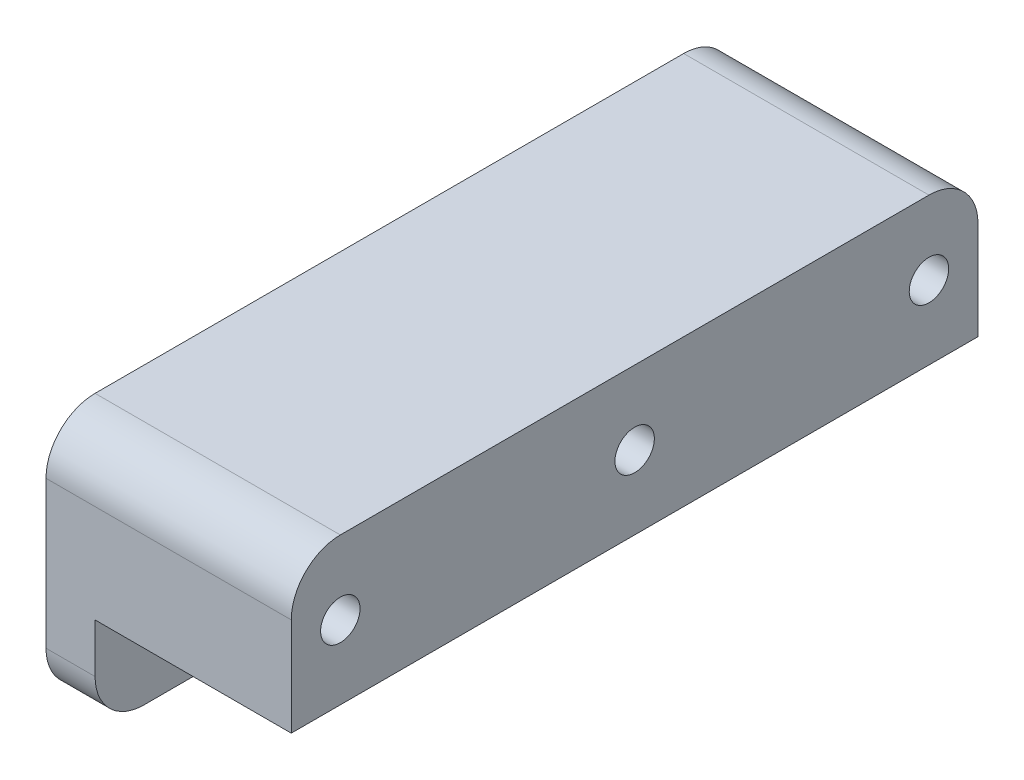
ISO-10303-21;
HEADER;
FILE_DESCRIPTION(('STEP AP214'),'2;1');
FILE_NAME('part.step','',(''),(''),'','','');
FILE_SCHEMA(('AUTOMOTIVE_DESIGN { 1 0 10303 214 1 1 1 1 }'));
ENDSEC;
DATA;
#1=APPLICATION_CONTEXT('core data for automotive mechanical design processes');
#2=APPLICATION_PROTOCOL_DEFINITION('international standard','automotive_design',2000,#1);
#3=PRODUCT_CONTEXT('',#1,'mechanical');
#4=PRODUCT('Part','Part','',(#3));
#5=PRODUCT_RELATED_PRODUCT_CATEGORY('part','',(#4));
#6=PRODUCT_DEFINITION_FORMATION('','',#4);
#7=PRODUCT_DEFINITION_CONTEXT('part definition',#1,'design');
#8=PRODUCT_DEFINITION('design','',#6,#7);
#9=PRODUCT_DEFINITION_SHAPE('','',#8);
#10=(LENGTH_UNIT() NAMED_UNIT(*) SI_UNIT(.MILLI.,.METRE.));
#11=(NAMED_UNIT(*) PLANE_ANGLE_UNIT() SI_UNIT($,.RADIAN.));
#12=(NAMED_UNIT(*) SI_UNIT($,.STERADIAN.) SOLID_ANGLE_UNIT());
#13=UNCERTAINTY_MEASURE_WITH_UNIT(LENGTH_MEASURE(1.E-05),#10,'distance_accuracy_value','');
#14=(GEOMETRIC_REPRESENTATION_CONTEXT(3) GLOBAL_UNCERTAINTY_ASSIGNED_CONTEXT((#13)) GLOBAL_UNIT_ASSIGNED_CONTEXT((#10,
#11,#12)) REPRESENTATION_CONTEXT('',''));
#15=CARTESIAN_POINT('',(0.,0.,0.));
#16=DIRECTION('',(0.,0.,1.));
#17=DIRECTION('',(1.,0.,0.));
#18=AXIS2_PLACEMENT_3D('',#15,#16,#17);
#19=CARTESIAN_POINT('',(317.498,38.9587049223983,406.4));
#20=DIRECTION('',(1.,0.,0.));
#21=DIRECTION('',(0.,1.,0.));
#22=AXIS2_PLACEMENT_3D('',#19,#20,#21);
#23=CYLINDRICAL_SURFACE('',#22,2.5527);
#24=CARTESIAN_POINT('',(342.9,38.9587049223983,406.4));
#25=DIRECTION('',(1.,0.,0.));
#26=DIRECTION('',(0.,1.,0.));
#27=AXIS2_PLACEMENT_3D('',#24,#25,#26);
#28=CIRCLE('',#27,2.5527);
#29=CARTESIAN_POINT('',(342.9,41.5114049223983,406.4));
#30=VERTEX_POINT('',#29);
#31=EDGE_CURVE('E442',#30,#30,#28,.T.);
#32=ORIENTED_EDGE('',*,*,#31,.T.);
#33=EDGE_LOOP('',(#32));
#34=FACE_BOUND('',#33,.T.);
#35=CARTESIAN_POINT('',(336.55,38.9587049223983,406.4));
#36=DIRECTION('',(-1.,0.,0.));
#37=DIRECTION('',(0.,-1.,0.));
#38=AXIS2_PLACEMENT_3D('',#35,#36,#37);
#39=CIRCLE('',#38,2.5527);
#40=CARTESIAN_POINT('',(336.55,36.4060049223983,406.4));
#41=VERTEX_POINT('',#40);
#42=EDGE_CURVE('E21',#41,#41,#39,.F.);
#43=ORIENTED_EDGE('',*,*,#42,.F.);
#44=EDGE_LOOP('',(#43));
#45=FACE_BOUND('',#44,.T.);
#46=ADVANCED_FACE('F17',(#34,#45),#23,.F.);
#47=CARTESIAN_POINT('',(317.498,38.9587049223983,444.5));
#48=DIRECTION('',(1.,0.,0.));
#49=DIRECTION('',(0.,1.,0.));
#50=AXIS2_PLACEMENT_3D('',#47,#48,#49);
#51=CYLINDRICAL_SURFACE('',#50,2.5527);
#52=CARTESIAN_POINT('',(342.9,38.9587049223983,444.5));
#53=DIRECTION('',(1.,0.,0.));
#54=DIRECTION('',(0.,1.,0.));
#55=AXIS2_PLACEMENT_3D('',#52,#53,#54);
#56=CIRCLE('',#55,2.5527);
#57=CARTESIAN_POINT('',(342.9,41.5114049223983,444.5));
#58=VERTEX_POINT('',#57);
#59=EDGE_CURVE('E447',#58,#58,#56,.T.);
#60=ORIENTED_EDGE('',*,*,#59,.T.);
#61=EDGE_LOOP('',(#60));
#62=FACE_BOUND('',#61,.T.);
#63=CARTESIAN_POINT('',(336.55,38.9587049223983,444.5));
#64=DIRECTION('',(-1.,0.,0.));
#65=DIRECTION('',(0.,-1.,0.));
#66=AXIS2_PLACEMENT_3D('',#63,#64,#65);
#67=CIRCLE('',#66,2.5527);
#68=CARTESIAN_POINT('',(336.55,36.4060049223983,444.5));
#69=VERTEX_POINT('',#68);
#70=EDGE_CURVE('E527',#69,#69,#67,.F.);
#71=ORIENTED_EDGE('',*,*,#70,.F.);
#72=EDGE_LOOP('',(#71));
#73=FACE_BOUND('',#72,.T.);
#74=ADVANCED_FACE('F538',(#62,#73),#51,.F.);
#75=CARTESIAN_POINT('',(317.498,38.9587049223983,368.3));
#76=DIRECTION('',(1.,0.,0.));
#77=DIRECTION('',(0.,1.,0.));
#78=AXIS2_PLACEMENT_3D('',#75,#76,#77);
#79=CYLINDRICAL_SURFACE('',#78,2.5527);
#80=CARTESIAN_POINT('',(342.9,38.9587049223983,368.3));
#81=DIRECTION('',(1.,0.,0.));
#82=DIRECTION('',(0.,1.,0.));
#83=AXIS2_PLACEMENT_3D('',#80,#81,#82);
#84=CIRCLE('',#83,2.5527);
#85=CARTESIAN_POINT('',(342.9,41.5114049223983,368.3));
#86=VERTEX_POINT('',#85);
#87=EDGE_CURVE('E438',#86,#86,#84,.T.);
#88=ORIENTED_EDGE('',*,*,#87,.T.);
#89=EDGE_LOOP('',(#88));
#90=FACE_BOUND('',#89,.T.);
#91=CARTESIAN_POINT('',(336.55,38.9587049223983,368.3));
#92=DIRECTION('',(-1.,0.,0.));
#93=DIRECTION('',(0.,-1.,0.));
#94=AXIS2_PLACEMENT_3D('',#91,#92,#93);
#95=CIRCLE('',#94,2.5527);
#96=CARTESIAN_POINT('',(336.55,36.4060049223983,368.3));
#97=VERTEX_POINT('',#96);
#98=EDGE_CURVE('E215',#97,#97,#95,.F.);
#99=ORIENTED_EDGE('',*,*,#98,.F.);
#100=EDGE_LOOP('',(#99));
#101=FACE_BOUND('',#100,.T.);
#102=ADVANCED_FACE('F544',(#90,#101),#79,.F.);
#103=CARTESIAN_POINT('',(317.498,38.9587049223983,450.85));
#104=DIRECTION('',(0.,0.,-1.));
#105=DIRECTION('',(-1.,0.,0.));
#106=AXIS2_PLACEMENT_3D('',#103,#104,#105);
#107=PLANE('',#106);
#108=DIRECTION('',(0.,-1.,0.));
#109=VECTOR('',#108,1.);
#110=CARTESIAN_POINT('',(311.15,32.6087049223982,450.85));
#111=LINE('',#110,#109);
#112=CARTESIAN_POINT('',(311.15,42.1337049223982,450.85));
#113=VERTEX_POINT('',#112);
#114=CARTESIAN_POINT('',(311.15,23.0837049223981,450.85));
#115=VERTEX_POINT('',#114);
#116=EDGE_CURVE('E423',#113,#115,#111,.T.);
#117=ORIENTED_EDGE('',*,*,#116,.T.);
#118=DIRECTION('',(1.,0.,0.));
#119=VECTOR('',#118,1.);
#120=CARTESIAN_POINT('',(317.498,23.0837049223981,450.85));
#121=LINE('',#120,#119);
#122=CARTESIAN_POINT('',(317.5,23.0837049223981,450.85));
#123=VERTEX_POINT('',#122);
#124=EDGE_CURVE('E501',#115,#123,#121,.T.);
#125=ORIENTED_EDGE('',*,*,#124,.T.);
#126=DIRECTION('',(0.,-1.,0.));
#127=VECTOR('',#126,1.);
#128=CARTESIAN_POINT('',(317.5,32.6087049223982,450.85));
#129=LINE('',#128,#127);
#130=CARTESIAN_POINT('',(317.5,29.4337049223984,450.85));
#131=VERTEX_POINT('',#130);
#132=EDGE_CURVE('E416',#131,#123,#129,.T.);
#133=ORIENTED_EDGE('',*,*,#132,.F.);
#134=DIRECTION('',(1.,0.,0.));
#135=VECTOR('',#134,1.);
#136=CARTESIAN_POINT('',(317.498,29.4337049223984,450.85));
#137=LINE('',#136,#135);
#138=CARTESIAN_POINT('',(342.9,29.4337049223983,450.85));
#139=VERTEX_POINT('',#138);
#140=EDGE_CURVE('E470',#131,#139,#137,.T.);
#141=ORIENTED_EDGE('',*,*,#140,.T.);
#142=DIRECTION('',(0.,1.,0.));
#143=VECTOR('',#142,1.);
#144=CARTESIAN_POINT('',(342.9,38.9587049223983,450.85));
#145=LINE('',#144,#143);
#146=CARTESIAN_POINT('',(342.9,42.1337049223982,450.85));
#147=VERTEX_POINT('',#146);
#148=EDGE_CURVE('E462',#139,#147,#145,.T.);
#149=ORIENTED_EDGE('',*,*,#148,.T.);
#150=DIRECTION('',(1.,0.,0.));
#151=VECTOR('',#150,1.);
#152=CARTESIAN_POINT('',(317.498,42.1337049223982,450.85));
#153=LINE('',#152,#151);
#154=EDGE_CURVE('E495',#147,#113,#153,.F.);
#155=ORIENTED_EDGE('',*,*,#154,.T.);
#156=EDGE_LOOP('',(#117,#125,#133,#141,#149,#155));
#157=FACE_BOUND('',#156,.T.);
#158=ADVANCED_FACE('F572',(#157),#107,.F.);
#159=CARTESIAN_POINT('',(317.498,29.4337049223985,126.465730464818));
#160=DIRECTION('',(0.,1.,0.));
#161=DIRECTION('',(-1.,0.,0.));
#162=AXIS2_PLACEMENT_3D('',#159,#160,#161);
#163=PLANE('',#162);
#164=DIRECTION('',(0.,0.,1.));
#165=VECTOR('',#164,1.);
#166=CARTESIAN_POINT('',(317.5,29.4337049223985,126.465730464818));
#167=LINE('',#166,#165);
#168=CARTESIAN_POINT('',(317.5,29.4337049223984,361.95));
#169=VERTEX_POINT('',#168);
#170=EDGE_CURVE('E427',#169,#131,#167,.T.);
#171=ORIENTED_EDGE('',*,*,#170,.F.);
#172=DIRECTION('',(1.,0.,0.));
#173=VECTOR('',#172,1.);
#174=CARTESIAN_POINT('',(317.498,29.4337049223984,361.95));
#175=LINE('',#174,#173);
#176=CARTESIAN_POINT('',(342.9,29.4337049223984,361.95));
#177=VERTEX_POINT('',#176);
#178=EDGE_CURVE('E443',#169,#177,#175,.T.);
#179=ORIENTED_EDGE('',*,*,#178,.T.);
#180=DIRECTION('',(0.,0.,1.));
#181=VECTOR('',#180,1.);
#182=CARTESIAN_POINT('',(342.9,29.4337049223985,126.465730464818));
#183=LINE('',#182,#181);
#184=EDGE_CURVE('E458',#177,#139,#183,.T.);
#185=ORIENTED_EDGE('',*,*,#184,.T.);
#186=ORIENTED_EDGE('',*,*,#140,.F.);
#187=EDGE_LOOP('',(#171,#179,#185,#186));
#188=FACE_BOUND('',#187,.T.);
#189=ADVANCED_FACE('F600',(#188),#163,.F.);
#190=CARTESIAN_POINT('',(317.498,38.9587049223983,361.95));
#191=DIRECTION('',(0.,0.,-1.));
#192=DIRECTION('',(-1.,0.,0.));
#193=AXIS2_PLACEMENT_3D('',#190,#191,#192);
#194=PLANE('',#193);
#195=DIRECTION('',(0.,-1.,0.));
#196=VECTOR('',#195,1.);
#197=CARTESIAN_POINT('',(317.5,32.6087049223981,361.95));
#198=LINE('',#197,#196);
#199=CARTESIAN_POINT('',(317.5,23.0837049223981,361.95));
#200=VERTEX_POINT('',#199);
#201=EDGE_CURVE('E428',#169,#200,#198,.T.);
#202=ORIENTED_EDGE('',*,*,#201,.T.);
#203=DIRECTION('',(1.,0.,0.));
#204=VECTOR('',#203,1.);
#205=CARTESIAN_POINT('',(311.15,23.0837049223981,361.95));
#206=LINE('',#205,#204);
#207=CARTESIAN_POINT('',(311.15,23.0837049223981,361.95));
#208=VERTEX_POINT('',#207);
#209=EDGE_CURVE('E27',#200,#208,#206,.F.);
#210=ORIENTED_EDGE('',*,*,#209,.T.);
#211=DIRECTION('',(0.,-1.,0.));
#212=VECTOR('',#211,1.);
#213=CARTESIAN_POINT('',(311.15,32.6087049223981,361.95));
#214=LINE('',#213,#212);
#215=CARTESIAN_POINT('',(311.15,42.1337049223982,361.95));
#216=VERTEX_POINT('',#215);
#217=EDGE_CURVE('E415',#216,#208,#214,.T.);
#218=ORIENTED_EDGE('',*,*,#217,.F.);
#219=DIRECTION('',(1.,0.,0.));
#220=VECTOR('',#219,1.);
#221=CARTESIAN_POINT('',(342.9,42.1337049223982,361.95));
#222=LINE('',#221,#220);
#223=CARTESIAN_POINT('',(342.9,42.1337049223982,361.95));
#224=VERTEX_POINT('',#223);
#225=EDGE_CURVE('E466',#216,#224,#222,.T.);
#226=ORIENTED_EDGE('',*,*,#225,.T.);
#227=DIRECTION('',(0.,1.,0.));
#228=VECTOR('',#227,1.);
#229=CARTESIAN_POINT('',(342.9,38.9587049223983,361.95));
#230=LINE('',#229,#228);
#231=EDGE_CURVE('E454',#177,#224,#230,.T.);
#232=ORIENTED_EDGE('',*,*,#231,.F.);
#233=ORIENTED_EDGE('',*,*,#178,.F.);
#234=EDGE_LOOP('',(#202,#210,#218,#226,#232,#233));
#235=FACE_BOUND('',#234,.T.);
#236=ADVANCED_FACE('F587',(#235),#194,.T.);
#237=CARTESIAN_POINT('',(317.498,48.4837049223981,406.4));
#238=DIRECTION('',(0.,-1.,0.));
#239=DIRECTION('',(1.,0.,0.));
#240=AXIS2_PLACEMENT_3D('',#237,#238,#239);
#241=PLANE('',#240);
#242=DIRECTION('',(0.,0.,1.));
#243=VECTOR('',#242,1.);
#244=CARTESIAN_POINT('',(311.15,48.4837049223982,406.4));
#245=LINE('',#244,#243);
#246=CARTESIAN_POINT('',(311.15,48.4837049223981,368.3));
#247=VERTEX_POINT('',#246);
#248=CARTESIAN_POINT('',(311.15,48.4837049223982,444.5));
#249=VERTEX_POINT('',#248);
#250=EDGE_CURVE('E411',#247,#249,#245,.T.);
#251=ORIENTED_EDGE('',*,*,#250,.T.);
#252=DIRECTION('',(1.,0.,0.));
#253=VECTOR('',#252,1.);
#254=CARTESIAN_POINT('',(317.498,48.4837049223981,444.5));
#255=LINE('',#254,#253);
#256=CARTESIAN_POINT('',(342.9,48.4837049223981,444.5));
#257=VERTEX_POINT('',#256);
#258=EDGE_CURVE('E488',#249,#257,#255,.T.);
#259=ORIENTED_EDGE('',*,*,#258,.T.);
#260=DIRECTION('',(0.,0.,-1.));
#261=VECTOR('',#260,1.);
#262=CARTESIAN_POINT('',(342.9,48.4837049223981,406.4));
#263=LINE('',#262,#261);
#264=CARTESIAN_POINT('',(342.9,48.4837049223981,368.3));
#265=VERTEX_POINT('',#264);
#266=EDGE_CURVE('E451',#257,#265,#263,.T.);
#267=ORIENTED_EDGE('',*,*,#266,.T.);
#268=DIRECTION('',(1.,0.,0.));
#269=VECTOR('',#268,1.);
#270=CARTESIAN_POINT('',(311.15,48.4837049223981,368.3));
#271=LINE('',#270,#269);
#272=EDGE_CURVE('E482',#265,#247,#271,.F.);
#273=ORIENTED_EDGE('',*,*,#272,.T.);
#274=EDGE_LOOP('',(#251,#259,#267,#273));
#275=FACE_BOUND('',#274,.T.);
#276=ADVANCED_FACE('F580',(#275),#241,.F.);
#277=CARTESIAN_POINT('',(342.9,4.03370492239605,323.85));
#278=DIRECTION('',(1.,0.,0.));
#279=DIRECTION('',(0.,1.,0.));
#280=AXIS2_PLACEMENT_3D('',#277,#278,#279);
#281=PLANE('',#280);
#282=ORIENTED_EDGE('',*,*,#266,.F.);
#283=CARTESIAN_POINT('',(342.9,42.1337049223982,444.5));
#284=DIRECTION('',(1.,0.,0.));
#285=DIRECTION('',(0.,1.,0.));
#286=AXIS2_PLACEMENT_3D('',#283,#284,#285);
#287=CIRCLE('',#286,6.35);
#288=EDGE_CURVE('E492',#257,#147,#287,.T.);
#289=ORIENTED_EDGE('',*,*,#288,.T.);
#290=ORIENTED_EDGE('',*,*,#148,.F.);
#291=ORIENTED_EDGE('',*,*,#184,.F.);
#292=ORIENTED_EDGE('',*,*,#231,.T.);
#293=CARTESIAN_POINT('',(342.9,42.1337049223982,368.3));
#294=DIRECTION('',(1.,0.,0.));
#295=DIRECTION('',(0.,1.,0.));
#296=AXIS2_PLACEMENT_3D('',#293,#294,#295);
#297=CIRCLE('',#296,6.35);
#298=EDGE_CURVE('E478',#224,#265,#297,.T.);
#299=ORIENTED_EDGE('',*,*,#298,.T.);
#300=EDGE_LOOP('',(#282,#289,#290,#291,#292,#299));
#301=FACE_BOUND('',#300,.T.);
#302=ORIENTED_EDGE('',*,*,#59,.F.);
#303=EDGE_LOOP('',(#302));
#304=FACE_BOUND('',#303,.T.);
#305=ORIENTED_EDGE('',*,*,#31,.F.);
#306=EDGE_LOOP('',(#305));
#307=FACE_BOUND('',#306,.T.);
#308=ORIENTED_EDGE('',*,*,#87,.F.);
#309=EDGE_LOOP('',(#308));
#310=FACE_BOUND('',#309,.T.);
#311=ADVANCED_FACE('F602',(#301,#304,#307,#310),#281,.T.);
#312=CARTESIAN_POINT('',(317.5,4.03370492239814,406.4));
#313=DIRECTION('',(-1.,0.,0.));
#314=DIRECTION('',(0.,-1.,0.));
#315=AXIS2_PLACEMENT_3D('',#312,#313,#314);
#316=PLANE('',#315);
#317=DIRECTION('',(0.,0.,1.));
#318=VECTOR('',#317,1.);
#319=CARTESIAN_POINT('',(317.5,16.7337049223981,406.4));
#320=LINE('',#319,#318);
#321=CARTESIAN_POINT('',(317.5,16.7337049223981,368.3));
#322=VERTEX_POINT('',#321);
#323=CARTESIAN_POINT('',(317.5,16.7337049223981,444.5));
#324=VERTEX_POINT('',#323);
#325=EDGE_CURVE('E432',#322,#324,#320,.T.);
#326=ORIENTED_EDGE('',*,*,#325,.F.);
#327=CARTESIAN_POINT('',(317.5,23.0837049223981,368.3));
#328=DIRECTION('',(-1.,0.,0.));
#329=DIRECTION('',(0.,-1.,0.));
#330=AXIS2_PLACEMENT_3D('',#327,#328,#329);
#331=CIRCLE('',#330,6.35);
#332=EDGE_CURVE('E520',#322,#200,#331,.F.);
#333=ORIENTED_EDGE('',*,*,#332,.T.);
#334=ORIENTED_EDGE('',*,*,#201,.F.);
#335=ORIENTED_EDGE('',*,*,#170,.T.);
#336=ORIENTED_EDGE('',*,*,#132,.T.);
#337=CARTESIAN_POINT('',(317.5,23.0837049223981,444.5));
#338=DIRECTION('',(-1.,0.,0.));
#339=DIRECTION('',(0.,-1.,0.));
#340=AXIS2_PLACEMENT_3D('',#337,#338,#339);
#341=CIRCLE('',#340,6.35);
#342=EDGE_CURVE('E505',#123,#324,#341,.F.);
#343=ORIENTED_EDGE('',*,*,#342,.T.);
#344=EDGE_LOOP('',(#326,#333,#334,#335,#336,#343));
#345=FACE_BOUND('',#344,.T.);
#346=ADVANCED_FACE('F597',(#345),#316,.F.);
#347=CARTESIAN_POINT('',(311.15,16.7337049223981,406.4));
#348=DIRECTION('',(0.,1.,0.));
#349=DIRECTION('',(-1.,0.,0.));
#350=AXIS2_PLACEMENT_3D('',#347,#348,#349);
#351=PLANE('',#350);
#352=DIRECTION('',(0.,0.,1.));
#353=VECTOR('',#352,1.);
#354=CARTESIAN_POINT('',(311.15,16.7337049223981,406.4));
#355=LINE('',#354,#353);
#356=CARTESIAN_POINT('',(311.15,16.7337049223981,368.3));
#357=VERTEX_POINT('',#356);
#358=CARTESIAN_POINT('',(311.15,16.7337049223981,444.5));
#359=VERTEX_POINT('',#358);
#360=EDGE_CURVE('E420',#357,#359,#355,.T.);
#361=ORIENTED_EDGE('',*,*,#360,.F.);
#362=DIRECTION('',(1.,0.,0.));
#363=VECTOR('',#362,1.);
#364=CARTESIAN_POINT('',(317.5,16.7337049223981,368.3));
#365=LINE('',#364,#363);
#366=EDGE_CURVE('E516',#357,#322,#365,.T.);
#367=ORIENTED_EDGE('',*,*,#366,.T.);
#368=ORIENTED_EDGE('',*,*,#325,.T.);
#369=DIRECTION('',(1.,0.,0.));
#370=VECTOR('',#369,1.);
#371=CARTESIAN_POINT('',(311.15,16.7337049223981,444.5));
#372=LINE('',#371,#370);
#373=EDGE_CURVE('E509',#324,#359,#372,.F.);
#374=ORIENTED_EDGE('',*,*,#373,.T.);
#375=EDGE_LOOP('',(#361,#367,#368,#374));
#376=FACE_BOUND('',#375,.T.);
#377=ADVANCED_FACE('F594',(#376),#351,.F.);
#378=CARTESIAN_POINT('',(311.15,4.03370492239814,406.4));
#379=DIRECTION('',(-1.,0.,0.));
#380=DIRECTION('',(0.,-1.,0.));
#381=AXIS2_PLACEMENT_3D('',#378,#379,#380);
#382=PLANE('',#381);
#383=DIRECTION('',(0.,0.866025403784444,-0.499999999999991));
#384=VECTOR('',#383,1.);
#385=CARTESIAN_POINT('',(311.15,41.3837049223983,448.700223208354));
#386=LINE('',#385,#384);
#387=CARTESIAN_POINT('',(311.15,38.9587049223983,450.10029761114));
#388=VERTEX_POINT('',#387);
#389=CARTESIAN_POINT('',(311.15,43.8087049223982,447.30014880557));
#390=VERTEX_POINT('',#389);
#391=EDGE_CURVE('E210',#388,#390,#386,.T.);
#392=ORIENTED_EDGE('',*,*,#391,.F.);
#393=DIRECTION('',(0.,0.866025403784431,0.500000000000014));
#394=VECTOR('',#393,1.);
#395=CARTESIAN_POINT('',(311.15,36.5337049223982,448.700223208354));
#396=LINE('',#395,#394);
#397=CARTESIAN_POINT('',(311.15,34.1087049223982,447.30014880557));
#398=VERTEX_POINT('',#397);
#399=EDGE_CURVE('E234',#398,#388,#396,.T.);
#400=ORIENTED_EDGE('',*,*,#399,.F.);
#401=DIRECTION('',(0.,0.,1.));
#402=VECTOR('',#401,1.);
#403=CARTESIAN_POINT('',(311.15,34.1087049223983,444.5));
#404=LINE('',#403,#402);
#405=CARTESIAN_POINT('',(311.15,34.1087049223983,441.69985119443));
#406=VERTEX_POINT('',#405);
#407=EDGE_CURVE('E35',#406,#398,#404,.T.);
#408=ORIENTED_EDGE('',*,*,#407,.F.);
#409=DIRECTION('',(0.,-0.866025403784443,0.499999999999992));
#410=VECTOR('',#409,1.);
#411=CARTESIAN_POINT('',(311.15,36.5337049223983,440.299776791646));
#412=LINE('',#411,#410);
#413=CARTESIAN_POINT('',(311.15,38.9587049223984,438.899702388861));
#414=VERTEX_POINT('',#413);
#415=EDGE_CURVE('E264',#414,#406,#412,.T.);
#416=ORIENTED_EDGE('',*,*,#415,.F.);
#417=DIRECTION('',(0.,-0.866025403784433,-0.50000000000001));
#418=VECTOR('',#417,1.);
#419=CARTESIAN_POINT('',(311.15,41.3837049223983,440.299776791646));
#420=LINE('',#419,#418);
#421=CARTESIAN_POINT('',(311.15,43.8087049223983,441.69985119443));
#422=VERTEX_POINT('',#421);
#423=EDGE_CURVE('E260',#422,#414,#420,.T.);
#424=ORIENTED_EDGE('',*,*,#423,.F.);
#425=DIRECTION('',(0.,0.,-1.));
#426=VECTOR('',#425,1.);
#427=CARTESIAN_POINT('',(311.15,43.8087049223983,444.5));
#428=LINE('',#427,#426);
#429=EDGE_CURVE('E256',#390,#422,#428,.T.);
#430=ORIENTED_EDGE('',*,*,#429,.F.);
#431=EDGE_LOOP('',(#392,#400,#408,#416,#424,#430));
#432=FACE_BOUND('',#431,.T.);
#433=DIRECTION('',(0.,0.,1.));
#434=VECTOR('',#433,1.);
#435=CARTESIAN_POINT('',(311.15,34.1087049223983,406.4));
#436=LINE('',#435,#434);
#437=CARTESIAN_POINT('',(311.15,34.1087049223983,403.599851194431));
#438=VERTEX_POINT('',#437);
#439=CARTESIAN_POINT('',(311.15,34.1087049223983,409.20014880557));
#440=VERTEX_POINT('',#439);
#441=EDGE_CURVE('E309',#438,#440,#436,.T.);
#442=ORIENTED_EDGE('',*,*,#441,.F.);
#443=DIRECTION('',(0.,-0.866025403784446,0.499999999999988));
#444=VECTOR('',#443,1.);
#445=CARTESIAN_POINT('',(311.15,36.5337049223983,402.199776791646));
#446=LINE('',#445,#444);
#447=CARTESIAN_POINT('',(311.15,38.9587049223983,400.799702388861));
#448=VERTEX_POINT('',#447);
#449=EDGE_CURVE('E288',#448,#438,#446,.T.);
#450=ORIENTED_EDGE('',*,*,#449,.F.);
#451=DIRECTION('',(0.,-0.866025403784433,-0.50000000000001));
#452=VECTOR('',#451,1.);
#453=CARTESIAN_POINT('',(311.15,41.3837049223983,402.199776791646));
#454=LINE('',#453,#452);
#455=CARTESIAN_POINT('',(311.15,43.8087049223983,403.599851194431));
#456=VERTEX_POINT('',#455);
#457=EDGE_CURVE('E43',#456,#448,#454,.T.);
#458=ORIENTED_EDGE('',*,*,#457,.F.);
#459=DIRECTION('',(0.,0.,-1.));
#460=VECTOR('',#459,1.);
#461=CARTESIAN_POINT('',(311.15,43.8087049223983,406.4));
#462=LINE('',#461,#460);
#463=CARTESIAN_POINT('',(311.15,43.8087049223982,409.20014880557));
#464=VERTEX_POINT('',#463);
#465=EDGE_CURVE('E322',#464,#456,#462,.T.);
#466=ORIENTED_EDGE('',*,*,#465,.F.);
#467=DIRECTION('',(0.,0.866025403784444,-0.49999999999999));
#468=VECTOR('',#467,1.);
#469=CARTESIAN_POINT('',(311.15,41.3837049223983,410.600223208354));
#470=LINE('',#469,#468);
#471=CARTESIAN_POINT('',(311.15,38.9587049223983,412.00029761114));
#472=VERTEX_POINT('',#471);
#473=EDGE_CURVE('E318',#472,#464,#470,.T.);
#474=ORIENTED_EDGE('',*,*,#473,.F.);
#475=DIRECTION('',(0.,0.866025403784431,0.500000000000013));
#476=VECTOR('',#475,1.);
#477=CARTESIAN_POINT('',(311.15,36.5337049223982,410.600223208354));
#478=LINE('',#477,#476);
#479=EDGE_CURVE('E313',#440,#472,#478,.T.);
#480=ORIENTED_EDGE('',*,*,#479,.F.);
#481=EDGE_LOOP('',(#442,#450,#458,#466,#474,#480));
#482=FACE_BOUND('',#481,.T.);
#483=DIRECTION('',(0.,0.,1.));
#484=VECTOR('',#483,1.);
#485=CARTESIAN_POINT('',(311.15,34.1087049223983,368.3));
#486=LINE('',#485,#484);
#487=CARTESIAN_POINT('',(311.15,34.1087049223982,365.499851194431));
#488=VERTEX_POINT('',#487);
#489=CARTESIAN_POINT('',(311.15,34.1087049223983,371.10014880557));
#490=VERTEX_POINT('',#489);
#491=EDGE_CURVE('E372',#488,#490,#486,.T.);
#492=ORIENTED_EDGE('',*,*,#491,.F.);
#493=DIRECTION('',(0.,-0.866025403784443,0.499999999999993));
#494=VECTOR('',#493,1.);
#495=CARTESIAN_POINT('',(311.15,36.5337049223983,364.099776791646));
#496=LINE('',#495,#494);
#497=CARTESIAN_POINT('',(311.15,38.9587049223984,362.699702388861));
#498=VERTEX_POINT('',#497);
#499=EDGE_CURVE('E351',#498,#488,#496,.T.);
#500=ORIENTED_EDGE('',*,*,#499,.F.);
#501=DIRECTION('',(0.,-0.866025403784433,-0.50000000000001));
#502=VECTOR('',#501,1.);
#503=CARTESIAN_POINT('',(311.15,41.3837049223983,364.099776791646));
#504=LINE('',#503,#502);
#505=CARTESIAN_POINT('',(311.15,43.8087049223983,365.499851194431));
#506=VERTEX_POINT('',#505);
#507=EDGE_CURVE('E388',#506,#498,#504,.T.);
#508=ORIENTED_EDGE('',*,*,#507,.F.);
#509=DIRECTION('',(0.,0.,-1.));
#510=VECTOR('',#509,1.);
#511=CARTESIAN_POINT('',(311.15,43.8087049223983,368.3));
#512=LINE('',#511,#510);
#513=CARTESIAN_POINT('',(311.15,43.8087049223982,371.10014880557));
#514=VERTEX_POINT('',#513);
#515=EDGE_CURVE('E384',#514,#506,#512,.T.);
#516=ORIENTED_EDGE('',*,*,#515,.F.);
#517=DIRECTION('',(0.,0.866025403784444,-0.499999999999991));
#518=VECTOR('',#517,1.);
#519=CARTESIAN_POINT('',(311.15,41.3837049223983,372.500223208354));
#520=LINE('',#519,#518);
#521=CARTESIAN_POINT('',(311.15,38.9587049223983,373.900297611139));
#522=VERTEX_POINT('',#521);
#523=EDGE_CURVE('E380',#522,#514,#520,.T.);
#524=ORIENTED_EDGE('',*,*,#523,.F.);
#525=DIRECTION('',(0.,0.866025403784434,0.500000000000009));
#526=VECTOR('',#525,1.);
#527=CARTESIAN_POINT('',(311.15,36.5337049223982,372.500223208355));
#528=LINE('',#527,#526);
#529=EDGE_CURVE('E376',#490,#522,#528,.T.);
#530=ORIENTED_EDGE('',*,*,#529,.F.);
#531=EDGE_LOOP('',(#492,#500,#508,#516,#524,#530));
#532=FACE_BOUND('',#531,.T.);
#533=ORIENTED_EDGE('',*,*,#217,.T.);
#534=CARTESIAN_POINT('',(311.15,23.0837049223981,368.3));
#535=DIRECTION('',(-1.,0.,0.));
#536=DIRECTION('',(0.,-1.,0.));
#537=AXIS2_PLACEMENT_3D('',#534,#535,#536);
#538=CIRCLE('',#537,6.35);
#539=EDGE_CURVE('E11',#208,#357,#538,.T.);
#540=ORIENTED_EDGE('',*,*,#539,.T.);
#541=ORIENTED_EDGE('',*,*,#360,.T.);
#542=CARTESIAN_POINT('',(311.15,23.0837049223981,444.5));
#543=DIRECTION('',(-1.,0.,0.));
#544=DIRECTION('',(0.,-1.,0.));
#545=AXIS2_PLACEMENT_3D('',#542,#543,#544);
#546=CIRCLE('',#545,6.35);
#547=EDGE_CURVE('E513',#359,#115,#546,.T.);
#548=ORIENTED_EDGE('',*,*,#547,.T.);
#549=ORIENTED_EDGE('',*,*,#116,.F.);
#550=CARTESIAN_POINT('',(311.15,42.1337049223982,444.5));
#551=DIRECTION('',(-1.,0.,0.));
#552=DIRECTION('',(0.,-1.,0.));
#553=AXIS2_PLACEMENT_3D('',#550,#551,#552);
#554=CIRCLE('',#553,6.35);
#555=EDGE_CURVE('E498',#113,#249,#554,.T.);
#556=ORIENTED_EDGE('',*,*,#555,.T.);
#557=ORIENTED_EDGE('',*,*,#250,.F.);
#558=CARTESIAN_POINT('',(311.15,42.1337049223982,368.3));
#559=DIRECTION('',(-1.,0.,0.));
#560=DIRECTION('',(0.,-1.,0.));
#561=AXIS2_PLACEMENT_3D('',#558,#559,#560);
#562=CIRCLE('',#561,6.35);
#563=EDGE_CURVE('E485',#247,#216,#562,.T.);
#564=ORIENTED_EDGE('',*,*,#563,.T.);
#565=EDGE_LOOP('',(#533,#540,#541,#548,#549,#556,#557,#564));
#566=FACE_BOUND('',#565,.T.);
#567=ADVANCED_FACE('F553',(#432,#482,#532,#566),#382,.T.);
#568=CARTESIAN_POINT('',(317.498,42.1337049223982,368.3));
#569=DIRECTION('',(-1.,0.,0.));
#570=DIRECTION('',(0.,-1.,0.));
#571=AXIS2_PLACEMENT_3D('',#568,#569,#570);
#572=CYLINDRICAL_SURFACE('',#571,6.35);
#573=ORIENTED_EDGE('',*,*,#563,.F.);
#574=ORIENTED_EDGE('',*,*,#272,.F.);
#575=ORIENTED_EDGE('',*,*,#298,.F.);
#576=ORIENTED_EDGE('',*,*,#225,.F.);
#577=EDGE_LOOP('',(#573,#574,#575,#576));
#578=FACE_BOUND('',#577,.T.);
#579=ADVANCED_FACE('F549',(#578),#572,.T.);
#580=CARTESIAN_POINT('',(317.498,42.1337049223982,444.5));
#581=DIRECTION('',(1.,0.,0.));
#582=DIRECTION('',(0.,1.,0.));
#583=AXIS2_PLACEMENT_3D('',#580,#581,#582);
#584=CYLINDRICAL_SURFACE('',#583,6.35);
#585=ORIENTED_EDGE('',*,*,#555,.F.);
#586=ORIENTED_EDGE('',*,*,#154,.F.);
#587=ORIENTED_EDGE('',*,*,#288,.F.);
#588=ORIENTED_EDGE('',*,*,#258,.F.);
#589=EDGE_LOOP('',(#585,#586,#587,#588));
#590=FACE_BOUND('',#589,.T.);
#591=ADVANCED_FACE('F552',(#590),#584,.T.);
#592=CARTESIAN_POINT('',(317.498,23.0837049223981,444.5));
#593=DIRECTION('',(1.,0.,0.));
#594=DIRECTION('',(0.,1.,0.));
#595=AXIS2_PLACEMENT_3D('',#592,#593,#594);
#596=CYLINDRICAL_SURFACE('',#595,6.35);
#597=ORIENTED_EDGE('',*,*,#547,.F.);
#598=ORIENTED_EDGE('',*,*,#373,.F.);
#599=ORIENTED_EDGE('',*,*,#342,.F.);
#600=ORIENTED_EDGE('',*,*,#124,.F.);
#601=EDGE_LOOP('',(#597,#598,#599,#600));
#602=FACE_BOUND('',#601,.T.);
#603=ADVANCED_FACE('F556',(#602),#596,.T.);
#604=CARTESIAN_POINT('',(311.15,23.0837049223981,368.3));
#605=DIRECTION('',(-1.,0.,0.));
#606=DIRECTION('',(0.,-1.,0.));
#607=AXIS2_PLACEMENT_3D('',#604,#605,#606);
#608=CYLINDRICAL_SURFACE('',#607,6.35);
#609=ORIENTED_EDGE('',*,*,#539,.F.);
#610=ORIENTED_EDGE('',*,*,#209,.F.);
#611=ORIENTED_EDGE('',*,*,#332,.F.);
#612=ORIENTED_EDGE('',*,*,#366,.F.);
#613=EDGE_LOOP('',(#609,#610,#611,#612));
#614=FACE_BOUND('',#613,.T.);
#615=ADVANCED_FACE('F19',(#614),#608,.T.);
#616=CARTESIAN_POINT('',(336.55,1.69620492239822,406.4));
#617=DIRECTION('',(-1.,0.,0.));
#618=DIRECTION('',(0.,-1.,0.));
#619=AXIS2_PLACEMENT_3D('',#616,#617,#618);
#620=PLANE('',#619);
#621=DIRECTION('',(0.,0.,1.));
#622=VECTOR('',#621,1.);
#623=CARTESIAN_POINT('',(336.55,34.1087049223983,368.3));
#624=LINE('',#623,#622);
#625=CARTESIAN_POINT('',(336.55,34.1087049223982,365.499851194431));
#626=VERTEX_POINT('',#625);
#627=CARTESIAN_POINT('',(336.55,34.1087049223983,371.10014880557));
#628=VERTEX_POINT('',#627);
#629=EDGE_CURVE('E346',#626,#628,#624,.T.);
#630=ORIENTED_EDGE('',*,*,#629,.T.);
#631=DIRECTION('',(0.,0.866025403784434,0.500000000000009));
#632=VECTOR('',#631,1.);
#633=CARTESIAN_POINT('',(336.55,36.5337049223982,372.500223208355));
#634=LINE('',#633,#632);
#635=CARTESIAN_POINT('',(336.55,38.9587049223983,373.900297611139));
#636=VERTEX_POINT('',#635);
#637=EDGE_CURVE('E350',#628,#636,#634,.T.);
#638=ORIENTED_EDGE('',*,*,#637,.T.);
#639=DIRECTION('',(0.,0.866025403784444,-0.499999999999991));
#640=VECTOR('',#639,1.);
#641=CARTESIAN_POINT('',(336.55,41.3837049223983,372.500223208354));
#642=LINE('',#641,#640);
#643=CARTESIAN_POINT('',(336.55,43.8087049223982,371.10014880557));
#644=VERTEX_POINT('',#643);
#645=EDGE_CURVE('E355',#636,#644,#642,.T.);
#646=ORIENTED_EDGE('',*,*,#645,.T.);
#647=DIRECTION('',(0.,0.,-1.));
#648=VECTOR('',#647,1.);
#649=CARTESIAN_POINT('',(336.55,43.8087049223982,368.3));
#650=LINE('',#649,#648);
#651=CARTESIAN_POINT('',(336.55,43.8087049223983,365.499851194431));
#652=VERTEX_POINT('',#651);
#653=EDGE_CURVE('E359',#644,#652,#650,.T.);
#654=ORIENTED_EDGE('',*,*,#653,.T.);
#655=DIRECTION('',(0.,-0.866025403784433,-0.50000000000001));
#656=VECTOR('',#655,1.);
#657=CARTESIAN_POINT('',(336.55,41.3837049223983,364.099776791646));
#658=LINE('',#657,#656);
#659=CARTESIAN_POINT('',(336.55,38.9587049223984,362.699702388861));
#660=VERTEX_POINT('',#659);
#661=EDGE_CURVE('E363',#652,#660,#658,.T.);
#662=ORIENTED_EDGE('',*,*,#661,.T.);
#663=DIRECTION('',(0.,-0.866025403784443,0.499999999999993));
#664=VECTOR('',#663,1.);
#665=CARTESIAN_POINT('',(336.55,36.5337049223983,364.099776791646));
#666=LINE('',#665,#664);
#667=EDGE_CURVE('E367',#660,#626,#666,.T.);
#668=ORIENTED_EDGE('',*,*,#667,.T.);
#669=EDGE_LOOP('',(#630,#638,#646,#654,#662,#668));
#670=FACE_BOUND('',#669,.T.);
#671=ORIENTED_EDGE('',*,*,#98,.T.);
#672=EDGE_LOOP('',(#671));
#673=FACE_BOUND('',#672,.T.);
#674=ADVANCED_FACE('F562',(#670,#673),#620,.T.);
#675=CARTESIAN_POINT('',(336.55,34.1087049223983,368.3));
#676=DIRECTION('',(0.,-1.,0.));
#677=DIRECTION('',(0.,0.,-1.));
#678=AXIS2_PLACEMENT_3D('',#675,#676,#677);
#679=PLANE('',#678);
#680=ORIENTED_EDGE('',*,*,#491,.T.);
#681=DIRECTION('',(-1.,0.,0.));
#682=VECTOR('',#681,1.);
#683=CARTESIAN_POINT('',(336.55,34.1087049223983,371.10014880557));
#684=LINE('',#683,#682);
#685=EDGE_CURVE('E314',#628,#490,#684,.T.);
#686=ORIENTED_EDGE('',*,*,#685,.F.);
#687=ORIENTED_EDGE('',*,*,#629,.F.);
#688=DIRECTION('',(-1.,0.,0.));
#689=VECTOR('',#688,1.);
#690=CARTESIAN_POINT('',(336.55,34.1087049223982,365.499851194431));
#691=LINE('',#690,#689);
#692=EDGE_CURVE('E371',#626,#488,#691,.T.);
#693=ORIENTED_EDGE('',*,*,#692,.T.);
#694=EDGE_LOOP('',(#680,#686,#687,#693));
#695=FACE_BOUND('',#694,.T.);
#696=ADVANCED_FACE('F618',(#695),#679,.F.);
#697=CARTESIAN_POINT('',(336.55,36.5337049223982,372.500223208355));
#698=DIRECTION('',(0.,-0.500000000000009,0.866025403784434));
#699=DIRECTION('',(0.,-0.866025403784434,-0.500000000000009));
#700=AXIS2_PLACEMENT_3D('',#697,#698,#699);
#701=PLANE('',#700);
#702=ORIENTED_EDGE('',*,*,#529,.T.);
#703=DIRECTION('',(-1.,0.,0.));
#704=VECTOR('',#703,1.);
#705=CARTESIAN_POINT('',(336.55,38.9587049223983,373.900297611139));
#706=LINE('',#705,#704);
#707=EDGE_CURVE('E406',#636,#522,#706,.T.);
#708=ORIENTED_EDGE('',*,*,#707,.F.);
#709=ORIENTED_EDGE('',*,*,#637,.F.);
#710=ORIENTED_EDGE('',*,*,#685,.T.);
#711=EDGE_LOOP('',(#702,#708,#709,#710));
#712=FACE_BOUND('',#711,.T.);
#713=ADVANCED_FACE('F623',(#712),#701,.F.);
#714=CARTESIAN_POINT('',(336.55,41.3837049223983,372.500223208354));
#715=DIRECTION('',(0.,0.499999999999991,0.866025403784444));
#716=DIRECTION('',(0.,-0.866025403784444,0.499999999999991));
#717=AXIS2_PLACEMENT_3D('',#714,#715,#716);
#718=PLANE('',#717);
#719=ORIENTED_EDGE('',*,*,#523,.T.);
#720=DIRECTION('',(-1.,0.,0.));
#721=VECTOR('',#720,1.);
#722=CARTESIAN_POINT('',(336.55,43.8087049223982,371.10014880557));
#723=LINE('',#722,#721);
#724=EDGE_CURVE('E403',#644,#514,#723,.T.);
#725=ORIENTED_EDGE('',*,*,#724,.F.);
#726=ORIENTED_EDGE('',*,*,#645,.F.);
#727=ORIENTED_EDGE('',*,*,#707,.T.);
#728=EDGE_LOOP('',(#719,#725,#726,#727));
#729=FACE_BOUND('',#728,.T.);
#730=ADVANCED_FACE('F641',(#729),#718,.F.);
#731=CARTESIAN_POINT('',(336.55,43.8087049223982,368.3));
#732=DIRECTION('',(0.,1.,0.));
#733=DIRECTION('',(0.,0.,1.));
#734=AXIS2_PLACEMENT_3D('',#731,#732,#733);
#735=PLANE('',#734);
#736=ORIENTED_EDGE('',*,*,#515,.T.);
#737=DIRECTION('',(-1.,0.,0.));
#738=VECTOR('',#737,1.);
#739=CARTESIAN_POINT('',(336.55,43.8087049223983,365.499851194431));
#740=LINE('',#739,#738);
#741=EDGE_CURVE('E400',#652,#506,#740,.T.);
#742=ORIENTED_EDGE('',*,*,#741,.F.);
#743=ORIENTED_EDGE('',*,*,#653,.F.);
#744=ORIENTED_EDGE('',*,*,#724,.T.);
#745=EDGE_LOOP('',(#736,#742,#743,#744));
#746=FACE_BOUND('',#745,.T.);
#747=ADVANCED_FACE('F637',(#746),#735,.F.);
#748=CARTESIAN_POINT('',(336.55,41.3837049223983,364.099776791646));
#749=DIRECTION('',(0.,0.50000000000001,-0.866025403784433));
#750=DIRECTION('',(0.,0.866025403784433,0.50000000000001));
#751=AXIS2_PLACEMENT_3D('',#748,#749,#750);
#752=PLANE('',#751);
#753=ORIENTED_EDGE('',*,*,#507,.T.);
#754=DIRECTION('',(-1.,0.,0.));
#755=VECTOR('',#754,1.);
#756=CARTESIAN_POINT('',(336.55,38.9587049223984,362.699702388861));
#757=LINE('',#756,#755);
#758=EDGE_CURVE('E396',#660,#498,#757,.T.);
#759=ORIENTED_EDGE('',*,*,#758,.F.);
#760=ORIENTED_EDGE('',*,*,#661,.F.);
#761=ORIENTED_EDGE('',*,*,#741,.T.);
#762=EDGE_LOOP('',(#753,#759,#760,#761));
#763=FACE_BOUND('',#762,.T.);
#764=ADVANCED_FACE('F633',(#763),#752,.F.);
#765=CARTESIAN_POINT('',(336.55,36.5337049223983,364.099776791646));
#766=DIRECTION('',(0.,-0.499999999999993,-0.866025403784443));
#767=DIRECTION('',(0.,0.866025403784443,-0.499999999999993));
#768=AXIS2_PLACEMENT_3D('',#765,#766,#767);
#769=PLANE('',#768);
#770=ORIENTED_EDGE('',*,*,#499,.T.);
#771=ORIENTED_EDGE('',*,*,#692,.F.);
#772=ORIENTED_EDGE('',*,*,#667,.F.);
#773=ORIENTED_EDGE('',*,*,#758,.T.);
#774=EDGE_LOOP('',(#770,#771,#772,#773));
#775=FACE_BOUND('',#774,.T.);
#776=ADVANCED_FACE('F630',(#775),#769,.F.);
#777=CARTESIAN_POINT('',(336.55,1.69620492239822,406.4));
#778=DIRECTION('',(-1.,0.,0.));
#779=DIRECTION('',(0.,-1.,0.));
#780=AXIS2_PLACEMENT_3D('',#777,#778,#779);
#781=PLANE('',#780);
#782=DIRECTION('',(0.,0.,1.));
#783=VECTOR('',#782,1.);
#784=CARTESIAN_POINT('',(336.55,34.1087049223983,406.4));
#785=LINE('',#784,#783);
#786=CARTESIAN_POINT('',(336.55,34.1087049223982,403.599851194431));
#787=VERTEX_POINT('',#786);
#788=CARTESIAN_POINT('',(336.55,34.1087049223983,409.20014880557));
#789=VERTEX_POINT('',#788);
#790=EDGE_CURVE('E283',#787,#789,#785,.T.);
#791=ORIENTED_EDGE('',*,*,#790,.T.);
#792=DIRECTION('',(0.,0.866025403784431,0.500000000000013));
#793=VECTOR('',#792,1.);
#794=CARTESIAN_POINT('',(336.55,36.5337049223982,410.600223208354));
#795=LINE('',#794,#793);
#796=CARTESIAN_POINT('',(336.55,38.9587049223983,412.00029761114));
#797=VERTEX_POINT('',#796);
#798=EDGE_CURVE('E287',#789,#797,#795,.T.);
#799=ORIENTED_EDGE('',*,*,#798,.T.);
#800=DIRECTION('',(0.,0.866025403784444,-0.49999999999999));
#801=VECTOR('',#800,1.);
#802=CARTESIAN_POINT('',(336.55,41.3837049223983,410.600223208354));
#803=LINE('',#802,#801);
#804=CARTESIAN_POINT('',(336.55,43.8087049223982,409.20014880557));
#805=VERTEX_POINT('',#804);
#806=EDGE_CURVE('E292',#797,#805,#803,.T.);
#807=ORIENTED_EDGE('',*,*,#806,.T.);
#808=DIRECTION('',(0.,0.,-1.));
#809=VECTOR('',#808,1.);
#810=CARTESIAN_POINT('',(336.55,43.8087049223982,406.4));
#811=LINE('',#810,#809);
#812=CARTESIAN_POINT('',(336.55,43.8087049223983,403.599851194431));
#813=VERTEX_POINT('',#812);
#814=EDGE_CURVE('E296',#805,#813,#811,.T.);
#815=ORIENTED_EDGE('',*,*,#814,.T.);
#816=DIRECTION('',(0.,-0.866025403784433,-0.50000000000001));
#817=VECTOR('',#816,1.);
#818=CARTESIAN_POINT('',(336.55,41.3837049223983,402.199776791646));
#819=LINE('',#818,#817);
#820=CARTESIAN_POINT('',(336.55,38.9587049223983,400.79970238886));
#821=VERTEX_POINT('',#820);
#822=EDGE_CURVE('E300',#813,#821,#819,.T.);
#823=ORIENTED_EDGE('',*,*,#822,.T.);
#824=DIRECTION('',(0.,-0.866025403784446,0.499999999999988));
#825=VECTOR('',#824,1.);
#826=CARTESIAN_POINT('',(336.55,36.5337049223983,402.199776791646));
#827=LINE('',#826,#825);
#828=EDGE_CURVE('E304',#821,#787,#827,.T.);
#829=ORIENTED_EDGE('',*,*,#828,.T.);
#830=EDGE_LOOP('',(#791,#799,#807,#815,#823,#829));
#831=FACE_BOUND('',#830,.T.);
#832=ORIENTED_EDGE('',*,*,#42,.T.);
#833=EDGE_LOOP('',(#832));
#834=FACE_BOUND('',#833,.T.);
#835=ADVANCED_FACE('F535',(#831,#834),#781,.T.);
#836=CARTESIAN_POINT('',(336.55,34.1087049223983,406.4));
#837=DIRECTION('',(0.,-1.,0.));
#838=DIRECTION('',(0.,0.,-1.));
#839=AXIS2_PLACEMENT_3D('',#836,#837,#838);
#840=PLANE('',#839);
#841=ORIENTED_EDGE('',*,*,#441,.T.);
#842=DIRECTION('',(-1.,0.,0.));
#843=VECTOR('',#842,1.);
#844=CARTESIAN_POINT('',(336.55,34.1087049223983,409.20014880557));
#845=LINE('',#844,#843);
#846=EDGE_CURVE('E257',#789,#440,#845,.T.);
#847=ORIENTED_EDGE('',*,*,#846,.F.);
#848=ORIENTED_EDGE('',*,*,#790,.F.);
#849=DIRECTION('',(-1.,0.,0.));
#850=VECTOR('',#849,1.);
#851=CARTESIAN_POINT('',(336.55,34.1087049223982,403.599851194431));
#852=LINE('',#851,#850);
#853=EDGE_CURVE('E308',#787,#438,#852,.T.);
#854=ORIENTED_EDGE('',*,*,#853,.T.);
#855=EDGE_LOOP('',(#841,#847,#848,#854));
#856=FACE_BOUND('',#855,.T.);
#857=ADVANCED_FACE('F628',(#856),#840,.F.);
#858=CARTESIAN_POINT('',(336.55,36.5337049223982,410.600223208354));
#859=DIRECTION('',(0.,-0.500000000000013,0.866025403784431));
#860=DIRECTION('',(0.,-0.866025403784431,-0.500000000000013));
#861=AXIS2_PLACEMENT_3D('',#858,#859,#860);
#862=PLANE('',#861);
#863=ORIENTED_EDGE('',*,*,#479,.T.);
#864=DIRECTION('',(-1.,0.,0.));
#865=VECTOR('',#864,1.);
#866=CARTESIAN_POINT('',(336.55,38.9587049223983,412.00029761114));
#867=LINE('',#866,#865);
#868=EDGE_CURVE('E341',#797,#472,#867,.T.);
#869=ORIENTED_EDGE('',*,*,#868,.F.);
#870=ORIENTED_EDGE('',*,*,#798,.F.);
#871=ORIENTED_EDGE('',*,*,#846,.T.);
#872=EDGE_LOOP('',(#863,#869,#870,#871));
#873=FACE_BOUND('',#872,.T.);
#874=ADVANCED_FACE('F748',(#873),#862,.F.);
#875=CARTESIAN_POINT('',(336.55,41.3837049223983,410.600223208354));
#876=DIRECTION('',(0.,0.49999999999999,0.866025403784444));
#877=DIRECTION('',(0.,-0.866025403784444,0.499999999999991));
#878=AXIS2_PLACEMENT_3D('',#875,#876,#877);
#879=PLANE('',#878);
#880=ORIENTED_EDGE('',*,*,#473,.T.);
#881=DIRECTION('',(-1.,0.,0.));
#882=VECTOR('',#881,1.);
#883=CARTESIAN_POINT('',(336.55,43.8087049223982,409.20014880557));
#884=LINE('',#883,#882);
#885=EDGE_CURVE('E338',#805,#464,#884,.T.);
#886=ORIENTED_EDGE('',*,*,#885,.F.);
#887=ORIENTED_EDGE('',*,*,#806,.F.);
#888=ORIENTED_EDGE('',*,*,#868,.T.);
#889=EDGE_LOOP('',(#880,#886,#887,#888));
#890=FACE_BOUND('',#889,.T.);
#891=ADVANCED_FACE('F756',(#890),#879,.F.);
#892=CARTESIAN_POINT('',(336.55,43.8087049223982,406.4));
#893=DIRECTION('',(0.,1.,0.));
#894=DIRECTION('',(0.,0.,1.));
#895=AXIS2_PLACEMENT_3D('',#892,#893,#894);
#896=PLANE('',#895);
#897=ORIENTED_EDGE('',*,*,#465,.T.);
#898=DIRECTION('',(-1.,0.,0.));
#899=VECTOR('',#898,1.);
#900=CARTESIAN_POINT('',(336.55,43.8087049223983,403.599851194431));
#901=LINE('',#900,#899);
#902=EDGE_CURVE('E335',#813,#456,#901,.T.);
#903=ORIENTED_EDGE('',*,*,#902,.F.);
#904=ORIENTED_EDGE('',*,*,#814,.F.);
#905=ORIENTED_EDGE('',*,*,#885,.T.);
#906=EDGE_LOOP('',(#897,#903,#904,#905));
#907=FACE_BOUND('',#906,.T.);
#908=ADVANCED_FACE('F764',(#907),#896,.F.);
#909=CARTESIAN_POINT('',(336.55,41.3837049223983,402.199776791646));
#910=DIRECTION('',(0.,0.50000000000001,-0.866025403784433));
#911=DIRECTION('',(0.,0.866025403784433,0.50000000000001));
#912=AXIS2_PLACEMENT_3D('',#909,#910,#911);
#913=PLANE('',#912);
#914=ORIENTED_EDGE('',*,*,#457,.T.);
#915=DIRECTION('',(-1.,0.,0.));
#916=VECTOR('',#915,1.);
#917=CARTESIAN_POINT('',(336.55,38.9587049223983,400.79970238886));
#918=LINE('',#917,#916);
#919=EDGE_CURVE('E333',#821,#448,#918,.T.);
#920=ORIENTED_EDGE('',*,*,#919,.F.);
#921=ORIENTED_EDGE('',*,*,#822,.F.);
#922=ORIENTED_EDGE('',*,*,#902,.T.);
#923=EDGE_LOOP('',(#914,#920,#921,#922));
#924=FACE_BOUND('',#923,.T.);
#925=ADVANCED_FACE('F773',(#924),#913,.F.);
#926=CARTESIAN_POINT('',(336.55,36.5337049223983,402.199776791646));
#927=DIRECTION('',(0.,-0.499999999999988,-0.866025403784446));
#928=DIRECTION('',(0.,0.866025403784446,-0.499999999999988));
#929=AXIS2_PLACEMENT_3D('',#926,#927,#928);
#930=PLANE('',#929);
#931=ORIENTED_EDGE('',*,*,#449,.T.);
#932=ORIENTED_EDGE('',*,*,#853,.F.);
#933=ORIENTED_EDGE('',*,*,#828,.F.);
#934=ORIENTED_EDGE('',*,*,#919,.T.);
#935=EDGE_LOOP('',(#931,#932,#933,#934));
#936=FACE_BOUND('',#935,.T.);
#937=ADVANCED_FACE('F782',(#936),#930,.F.);
#938=CARTESIAN_POINT('',(336.55,1.69620492239822,406.4));
#939=DIRECTION('',(-1.,0.,0.));
#940=DIRECTION('',(0.,-1.,0.));
#941=AXIS2_PLACEMENT_3D('',#938,#939,#940);
#942=PLANE('',#941);
#943=DIRECTION('',(0.,0.866025403784444,-0.499999999999991));
#944=VECTOR('',#943,1.);
#945=CARTESIAN_POINT('',(336.55,41.3837049223983,448.700223208354));
#946=LINE('',#945,#944);
#947=CARTESIAN_POINT('',(336.55,38.9587049223983,450.10029761114));
#948=VERTEX_POINT('',#947);
#949=CARTESIAN_POINT('',(336.55,43.8087049223982,447.30014880557));
#950=VERTEX_POINT('',#949);
#951=EDGE_CURVE('E208',#948,#950,#946,.T.);
#952=ORIENTED_EDGE('',*,*,#951,.T.);
#953=DIRECTION('',(0.,0.,-1.));
#954=VECTOR('',#953,1.);
#955=CARTESIAN_POINT('',(336.55,43.8087049223983,444.5));
#956=LINE('',#955,#954);
#957=CARTESIAN_POINT('',(336.55,43.8087049223983,441.69985119443));
#958=VERTEX_POINT('',#957);
#959=EDGE_CURVE('E219',#950,#958,#956,.T.);
#960=ORIENTED_EDGE('',*,*,#959,.T.);
#961=DIRECTION('',(0.,-0.866025403784433,-0.50000000000001));
#962=VECTOR('',#961,1.);
#963=CARTESIAN_POINT('',(336.55,41.3837049223983,440.299776791646));
#964=LINE('',#963,#962);
#965=CARTESIAN_POINT('',(336.55,38.9587049223983,438.899702388861));
#966=VERTEX_POINT('',#965);
#967=EDGE_CURVE('E225',#958,#966,#964,.T.);
#968=ORIENTED_EDGE('',*,*,#967,.T.);
#969=DIRECTION('',(0.,-0.866025403784443,0.499999999999992));
#970=VECTOR('',#969,1.);
#971=CARTESIAN_POINT('',(336.55,36.5337049223983,440.299776791646));
#972=LINE('',#971,#970);
#973=CARTESIAN_POINT('',(336.55,34.1087049223983,441.69985119443));
#974=VERTEX_POINT('',#973);
#975=EDGE_CURVE('E244',#966,#974,#972,.T.);
#976=ORIENTED_EDGE('',*,*,#975,.T.);
#977=DIRECTION('',(0.,0.,1.));
#978=VECTOR('',#977,1.);
#979=CARTESIAN_POINT('',(336.55,34.1087049223983,444.5));
#980=LINE('',#979,#978);
#981=CARTESIAN_POINT('',(336.55,34.1087049223982,447.30014880557));
#982=VERTEX_POINT('',#981);
#983=EDGE_CURVE('E248',#974,#982,#980,.T.);
#984=ORIENTED_EDGE('',*,*,#983,.T.);
#985=DIRECTION('',(0.,0.866025403784431,0.500000000000014));
#986=VECTOR('',#985,1.);
#987=CARTESIAN_POINT('',(336.55,36.5337049223982,448.700223208354));
#988=LINE('',#987,#986);
#989=EDGE_CURVE('E232',#982,#948,#988,.T.);
#990=ORIENTED_EDGE('',*,*,#989,.T.);
#991=EDGE_LOOP('',(#952,#960,#968,#976,#984,#990));
#992=FACE_BOUND('',#991,.T.);
#993=ORIENTED_EDGE('',*,*,#70,.T.);
#994=EDGE_LOOP('',(#993));
#995=FACE_BOUND('',#994,.T.);
#996=ADVANCED_FACE('F228',(#992,#995),#942,.T.);
#997=CARTESIAN_POINT('',(336.55,41.3837049223983,448.700223208354));
#998=DIRECTION('',(0.,0.499999999999991,0.866025403784444));
#999=DIRECTION('',(0.,-0.866025403784444,0.499999999999991));
#1000=AXIS2_PLACEMENT_3D('',#997,#998,#999);
#1001=PLANE('',#1000);
#1002=ORIENTED_EDGE('',*,*,#391,.T.);
#1003=DIRECTION('',(-1.,0.,0.));
#1004=VECTOR('',#1003,1.);
#1005=CARTESIAN_POINT('',(336.55,43.8087049223982,447.30014880557));
#1006=LINE('',#1005,#1004);
#1007=EDGE_CURVE('E204',#950,#390,#1006,.T.);
#1008=ORIENTED_EDGE('',*,*,#1007,.F.);
#1009=ORIENTED_EDGE('',*,*,#951,.F.);
#1010=DIRECTION('',(-1.,0.,0.));
#1011=VECTOR('',#1010,1.);
#1012=CARTESIAN_POINT('',(336.55,38.9587049223983,450.10029761114));
#1013=LINE('',#1012,#1011);
#1014=EDGE_CURVE('E253',#948,#388,#1013,.T.);
#1015=ORIENTED_EDGE('',*,*,#1014,.T.);
#1016=EDGE_LOOP('',(#1002,#1008,#1009,#1015));
#1017=FACE_BOUND('',#1016,.T.);
#1018=ADVANCED_FACE('F206',(#1017),#1001,.F.);
#1019=CARTESIAN_POINT('',(336.55,43.8087049223983,444.5));
#1020=DIRECTION('',(0.,1.,0.));
#1021=DIRECTION('',(0.,0.,1.));
#1022=AXIS2_PLACEMENT_3D('',#1019,#1020,#1021);
#1023=PLANE('',#1022);
#1024=ORIENTED_EDGE('',*,*,#429,.T.);
#1025=DIRECTION('',(-1.,0.,0.));
#1026=VECTOR('',#1025,1.);
#1027=CARTESIAN_POINT('',(336.55,43.8087049223983,441.69985119443));
#1028=LINE('',#1027,#1026);
#1029=EDGE_CURVE('E216',#958,#422,#1028,.T.);
#1030=ORIENTED_EDGE('',*,*,#1029,.F.);
#1031=ORIENTED_EDGE('',*,*,#959,.F.);
#1032=ORIENTED_EDGE('',*,*,#1007,.T.);
#1033=EDGE_LOOP('',(#1024,#1030,#1031,#1032));
#1034=FACE_BOUND('',#1033,.T.);
#1035=ADVANCED_FACE('F220',(#1034),#1023,.F.);
#1036=CARTESIAN_POINT('',(336.55,41.3837049223983,440.299776791646));
#1037=DIRECTION('',(0.,0.50000000000001,-0.866025403784433));
#1038=DIRECTION('',(0.,0.866025403784433,0.50000000000001));
#1039=AXIS2_PLACEMENT_3D('',#1036,#1037,#1038);
#1040=PLANE('',#1039);
#1041=ORIENTED_EDGE('',*,*,#423,.T.);
#1042=DIRECTION('',(-1.,0.,0.));
#1043=VECTOR('',#1042,1.);
#1044=CARTESIAN_POINT('',(336.55,38.9587049223983,438.899702388861));
#1045=LINE('',#1044,#1043);
#1046=EDGE_CURVE('E278',#966,#414,#1045,.T.);
#1047=ORIENTED_EDGE('',*,*,#1046,.F.);
#1048=ORIENTED_EDGE('',*,*,#967,.F.);
#1049=ORIENTED_EDGE('',*,*,#1029,.T.);
#1050=EDGE_LOOP('',(#1041,#1047,#1048,#1049));
#1051=FACE_BOUND('',#1050,.T.);
#1052=ADVANCED_FACE('F812',(#1051),#1040,.F.);
#1053=CARTESIAN_POINT('',(336.55,36.5337049223983,440.299776791646));
#1054=DIRECTION('',(0.,-0.499999999999992,-0.866025403784443));
#1055=DIRECTION('',(0.,0.866025403784443,-0.499999999999993));
#1056=AXIS2_PLACEMENT_3D('',#1053,#1054,#1055);
#1057=PLANE('',#1056);
#1058=ORIENTED_EDGE('',*,*,#415,.T.);
#1059=DIRECTION('',(-1.,0.,0.));
#1060=VECTOR('',#1059,1.);
#1061=CARTESIAN_POINT('',(336.55,34.1087049223983,441.69985119443));
#1062=LINE('',#1061,#1060);
#1063=EDGE_CURVE('E275',#974,#406,#1062,.T.);
#1064=ORIENTED_EDGE('',*,*,#1063,.F.);
#1065=ORIENTED_EDGE('',*,*,#975,.F.);
#1066=ORIENTED_EDGE('',*,*,#1046,.T.);
#1067=EDGE_LOOP('',(#1058,#1064,#1065,#1066));
#1068=FACE_BOUND('',#1067,.T.);
#1069=ADVANCED_FACE('F820',(#1068),#1057,.F.);
#1070=CARTESIAN_POINT('',(336.55,34.1087049223983,444.5));
#1071=DIRECTION('',(0.,-1.,0.));
#1072=DIRECTION('',(0.,0.,-1.));
#1073=AXIS2_PLACEMENT_3D('',#1070,#1071,#1072);
#1074=PLANE('',#1073);
#1075=ORIENTED_EDGE('',*,*,#407,.T.);
#1076=DIRECTION('',(-1.,0.,0.));
#1077=VECTOR('',#1076,1.);
#1078=CARTESIAN_POINT('',(336.55,34.1087049223982,447.30014880557));
#1079=LINE('',#1078,#1077);
#1080=EDGE_CURVE('E272',#982,#398,#1079,.T.);
#1081=ORIENTED_EDGE('',*,*,#1080,.F.);
#1082=ORIENTED_EDGE('',*,*,#983,.F.);
#1083=ORIENTED_EDGE('',*,*,#1063,.T.);
#1084=EDGE_LOOP('',(#1075,#1081,#1082,#1083));
#1085=FACE_BOUND('',#1084,.T.);
#1086=ADVANCED_FACE('F829',(#1085),#1074,.F.);
#1087=CARTESIAN_POINT('',(336.55,36.5337049223982,448.700223208354));
#1088=DIRECTION('',(0.,-0.500000000000014,0.866025403784431));
#1089=DIRECTION('',(0.,-0.866025403784431,-0.500000000000014));
#1090=AXIS2_PLACEMENT_3D('',#1087,#1088,#1089);
#1091=PLANE('',#1090);
#1092=ORIENTED_EDGE('',*,*,#399,.T.);
#1093=ORIENTED_EDGE('',*,*,#1014,.F.);
#1094=ORIENTED_EDGE('',*,*,#989,.F.);
#1095=ORIENTED_EDGE('',*,*,#1080,.T.);
#1096=EDGE_LOOP('',(#1092,#1093,#1094,#1095));
#1097=FACE_BOUND('',#1096,.T.);
#1098=ADVANCED_FACE('F838',(#1097),#1091,.F.);
#1099=CLOSED_SHELL('',(#46,#74,#102,#158,#189,#236,#276,#311,#346,#377,#567,#579,#591,#603,#615,
#674,#696,#713,#730,#747,#764,#776,#835,#857,#874,#891,#908,#925,#937,#996,#1018,#1035,#1052,
#1069,#1086,#1098));
#1100=MANIFOLD_SOLID_BREP('B1',#1099);
#1101=ADVANCED_BREP_SHAPE_REPRESENTATION('',(#18,#1100),#14);
#1102=SHAPE_DEFINITION_REPRESENTATION(#9,#1101);
ENDSEC;
END-ISO-10303-21;
